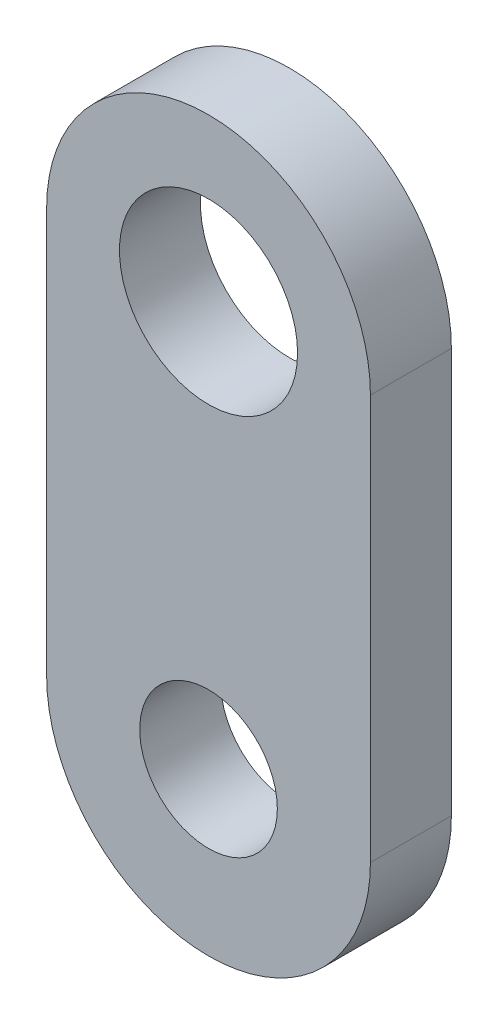
ISO-10303-21;
HEADER;
FILE_DESCRIPTION(('STEP AP214'),'2;1');
FILE_NAME('part.step','',(''),(''),'','','');
FILE_SCHEMA(('AUTOMOTIVE_DESIGN { 1 0 10303 214 1 1 1 1 }'));
ENDSEC;
DATA;
#1=APPLICATION_CONTEXT('core data for automotive mechanical design processes');
#2=APPLICATION_PROTOCOL_DEFINITION('international standard','automotive_design',2000,#1);
#3=PRODUCT_CONTEXT('',#1,'mechanical');
#4=PRODUCT('Part','Part','',(#3));
#5=PRODUCT_RELATED_PRODUCT_CATEGORY('part','',(#4));
#6=PRODUCT_DEFINITION_FORMATION('','',#4);
#7=PRODUCT_DEFINITION_CONTEXT('part definition',#1,'design');
#8=PRODUCT_DEFINITION('design','',#6,#7);
#9=PRODUCT_DEFINITION_SHAPE('','',#8);
#10=(LENGTH_UNIT() NAMED_UNIT(*) SI_UNIT(.MILLI.,.METRE.));
#11=(NAMED_UNIT(*) PLANE_ANGLE_UNIT() SI_UNIT($,.RADIAN.));
#12=(NAMED_UNIT(*) SI_UNIT($,.STERADIAN.) SOLID_ANGLE_UNIT());
#13=UNCERTAINTY_MEASURE_WITH_UNIT(LENGTH_MEASURE(1.E-05),#10,'distance_accuracy_value','');
#14=(GEOMETRIC_REPRESENTATION_CONTEXT(3) GLOBAL_UNCERTAINTY_ASSIGNED_CONTEXT((#13)) GLOBAL_UNIT_ASSIGNED_CONTEXT((#10,
#11,#12)) REPRESENTATION_CONTEXT('',''));
#15=CARTESIAN_POINT('',(0.,0.,0.));
#16=DIRECTION('',(0.,0.,1.));
#17=DIRECTION('',(1.,0.,0.));
#18=AXIS2_PLACEMENT_3D('',#15,#16,#17);
#19=CARTESIAN_POINT('',(0.,-25.,10.));
#20=DIRECTION('',(0.,0.,1.));
#21=DIRECTION('',(1.,0.,0.));
#22=AXIS2_PLACEMENT_3D('',#19,#20,#21);
#23=PLANE('',#22);
#24=CARTESIAN_POINT('',(0.,25.,10.));
#25=DIRECTION('',(0.,0.,1.));
#26=DIRECTION('',(1.,0.,0.));
#27=AXIS2_PLACEMENT_3D('',#24,#25,#26);
#28=CIRCLE('',#27,11.);
#29=CARTESIAN_POINT('',(11.,25.,10.));
#30=VERTEX_POINT('',#29);
#31=EDGE_CURVE('E109',#30,#30,#28,.T.);
#32=ORIENTED_EDGE('',*,*,#31,.F.);
#33=EDGE_LOOP('',(#32));
#34=FACE_BOUND('',#33,.T.);
#35=CARTESIAN_POINT('',(0.,-25.,10.));
#36=DIRECTION('',(0.,0.,1.));
#37=DIRECTION('',(1.,0.,0.));
#38=AXIS2_PLACEMENT_3D('',#35,#36,#37);
#39=CIRCLE('',#38,20.);
#40=CARTESIAN_POINT('',(-20.,-25.,10.));
#41=VERTEX_POINT('',#40);
#42=CARTESIAN_POINT('',(20.,-25.,10.));
#43=VERTEX_POINT('',#42);
#44=EDGE_CURVE('E88',#41,#43,#39,.T.);
#45=ORIENTED_EDGE('',*,*,#44,.T.);
#46=DIRECTION('',(0.,1.,0.));
#47=VECTOR('',#46,1.);
#48=CARTESIAN_POINT('',(20.,25.,10.));
#49=LINE('',#48,#47);
#50=CARTESIAN_POINT('',(20.,25.,10.));
#51=VERTEX_POINT('',#50);
#52=EDGE_CURVE('E83',#43,#51,#49,.T.);
#53=ORIENTED_EDGE('',*,*,#52,.T.);
#54=CARTESIAN_POINT('',(0.,25.,10.));
#55=DIRECTION('',(0.,0.,1.));
#56=DIRECTION('',(-1.,0.,0.));
#57=AXIS2_PLACEMENT_3D('',#54,#55,#56);
#58=CIRCLE('',#57,20.);
#59=CARTESIAN_POINT('',(-20.,25.,10.));
#60=VERTEX_POINT('',#59);
#61=EDGE_CURVE('E86',#51,#60,#58,.T.);
#62=ORIENTED_EDGE('',*,*,#61,.T.);
#63=DIRECTION('',(0.,-1.,0.));
#64=VECTOR('',#63,1.);
#65=CARTESIAN_POINT('',(-20.,25.,10.));
#66=LINE('',#65,#64);
#67=EDGE_CURVE('E53',#60,#41,#66,.T.);
#68=ORIENTED_EDGE('',*,*,#67,.T.);
#69=EDGE_LOOP('',(#45,#53,#62,#68));
#70=FACE_BOUND('',#69,.T.);
#71=CARTESIAN_POINT('',(0.,-25.,10.));
#72=DIRECTION('',(0.,0.,1.));
#73=DIRECTION('',(1.,0.,0.));
#74=AXIS2_PLACEMENT_3D('',#71,#72,#73);
#75=CIRCLE('',#74,8.5);
#76=CARTESIAN_POINT('',(8.50000000000001,-25.,10.));
#77=VERTEX_POINT('',#76);
#78=EDGE_CURVE('E133',#77,#77,#75,.T.);
#79=ORIENTED_EDGE('',*,*,#78,.F.);
#80=EDGE_LOOP('',(#79));
#81=FACE_BOUND('',#80,.T.);
#82=ADVANCED_FACE('F35',(#34,#70,#81),#23,.T.);
#83=CARTESIAN_POINT('',(0.,-25.,0.));
#84=DIRECTION('',(0.,0.,1.));
#85=DIRECTION('',(1.,0.,0.));
#86=AXIS2_PLACEMENT_3D('',#83,#84,#85);
#87=PLANE('',#86);
#88=CARTESIAN_POINT('',(0.,-25.,0.));
#89=DIRECTION('',(0.,0.,1.));
#90=DIRECTION('',(1.,0.,0.));
#91=AXIS2_PLACEMENT_3D('',#88,#89,#90);
#92=CIRCLE('',#91,20.);
#93=CARTESIAN_POINT('',(-20.,-25.,0.));
#94=VERTEX_POINT('',#93);
#95=CARTESIAN_POINT('',(20.,-25.,0.));
#96=VERTEX_POINT('',#95);
#97=EDGE_CURVE('E105',#94,#96,#92,.T.);
#98=ORIENTED_EDGE('',*,*,#97,.F.);
#99=DIRECTION('',(0.,-1.,0.));
#100=VECTOR('',#99,1.);
#101=CARTESIAN_POINT('',(-20.,25.,0.));
#102=LINE('',#101,#100);
#103=CARTESIAN_POINT('',(-20.,25.,0.));
#104=VERTEX_POINT('',#103);
#105=EDGE_CURVE('E76',#104,#94,#102,.T.);
#106=ORIENTED_EDGE('',*,*,#105,.F.);
#107=CARTESIAN_POINT('',(0.,25.,0.));
#108=DIRECTION('',(0.,0.,1.));
#109=DIRECTION('',(-1.,0.,0.));
#110=AXIS2_PLACEMENT_3D('',#107,#108,#109);
#111=CIRCLE('',#110,20.);
#112=CARTESIAN_POINT('',(20.,25.,0.));
#113=VERTEX_POINT('',#112);
#114=EDGE_CURVE('E70',#113,#104,#111,.T.);
#115=ORIENTED_EDGE('',*,*,#114,.F.);
#116=DIRECTION('',(0.,1.,0.));
#117=VECTOR('',#116,1.);
#118=CARTESIAN_POINT('',(20.,25.,0.));
#119=LINE('',#118,#117);
#120=EDGE_CURVE('E93',#96,#113,#119,.T.);
#121=ORIENTED_EDGE('',*,*,#120,.F.);
#122=EDGE_LOOP('',(#98,#106,#115,#121));
#123=FACE_BOUND('',#122,.T.);
#124=CARTESIAN_POINT('',(0.,25.,0.));
#125=DIRECTION('',(0.,0.,1.));
#126=DIRECTION('',(1.,0.,0.));
#127=AXIS2_PLACEMENT_3D('',#124,#125,#126);
#128=CIRCLE('',#127,11.);
#129=CARTESIAN_POINT('',(11.,25.,0.));
#130=VERTEX_POINT('',#129);
#131=EDGE_CURVE('E129',#130,#130,#128,.T.);
#132=ORIENTED_EDGE('',*,*,#131,.T.);
#133=EDGE_LOOP('',(#132));
#134=FACE_BOUND('',#133,.T.);
#135=CARTESIAN_POINT('',(0.,-25.,0.));
#136=DIRECTION('',(0.,0.,1.));
#137=DIRECTION('',(1.,0.,0.));
#138=AXIS2_PLACEMENT_3D('',#135,#136,#137);
#139=CIRCLE('',#138,8.5);
#140=CARTESIAN_POINT('',(8.50000000000001,-25.,0.));
#141=VERTEX_POINT('',#140);
#142=EDGE_CURVE('E137',#141,#141,#139,.T.);
#143=ORIENTED_EDGE('',*,*,#142,.T.);
#144=EDGE_LOOP('',(#143));
#145=FACE_BOUND('',#144,.T.);
#146=ADVANCED_FACE('F123',(#123,#134,#145),#87,.F.);
#147=CARTESIAN_POINT('',(0.,-25.,10.));
#148=DIRECTION('',(0.,0.,-1.));
#149=DIRECTION('',(-1.,0.,0.));
#150=AXIS2_PLACEMENT_3D('',#147,#148,#149);
#151=CYLINDRICAL_SURFACE('',#150,20.);
#152=ORIENTED_EDGE('',*,*,#97,.T.);
#153=DIRECTION('',(0.,0.,-1.));
#154=VECTOR('',#153,1.);
#155=CARTESIAN_POINT('',(20.,-25.,10.));
#156=LINE('',#155,#154);
#157=EDGE_CURVE('E11',#43,#96,#156,.T.);
#158=ORIENTED_EDGE('',*,*,#157,.F.);
#159=ORIENTED_EDGE('',*,*,#44,.F.);
#160=DIRECTION('',(0.,0.,-1.));
#161=VECTOR('',#160,1.);
#162=CARTESIAN_POINT('',(-20.,-25.,10.));
#163=LINE('',#162,#161);
#164=EDGE_CURVE('E101',#41,#94,#163,.T.);
#165=ORIENTED_EDGE('',*,*,#164,.T.);
#166=EDGE_LOOP('',(#152,#158,#159,#165));
#167=FACE_BOUND('',#166,.T.);
#168=ADVANCED_FACE('F37',(#167),#151,.T.);
#169=CARTESIAN_POINT('',(20.,25.,10.));
#170=DIRECTION('',(-1.,0.,0.));
#171=DIRECTION('',(0.,-1.,0.));
#172=AXIS2_PLACEMENT_3D('',#169,#170,#171);
#173=PLANE('',#172);
#174=ORIENTED_EDGE('',*,*,#120,.T.);
#175=DIRECTION('',(0.,0.,-1.));
#176=VECTOR('',#175,1.);
#177=CARTESIAN_POINT('',(20.,25.,10.));
#178=LINE('',#177,#176);
#179=EDGE_CURVE('E45',#51,#113,#178,.T.);
#180=ORIENTED_EDGE('',*,*,#179,.F.);
#181=ORIENTED_EDGE('',*,*,#52,.F.);
#182=ORIENTED_EDGE('',*,*,#157,.T.);
#183=EDGE_LOOP('',(#174,#180,#181,#182));
#184=FACE_BOUND('',#183,.T.);
#185=ADVANCED_FACE('F92',(#184),#173,.F.);
#186=CARTESIAN_POINT('',(0.,25.,10.));
#187=DIRECTION('',(0.,0.,-1.));
#188=DIRECTION('',(-1.,0.,0.));
#189=AXIS2_PLACEMENT_3D('',#186,#187,#188);
#190=CYLINDRICAL_SURFACE('',#189,20.);
#191=ORIENTED_EDGE('',*,*,#114,.T.);
#192=DIRECTION('',(0.,0.,-1.));
#193=VECTOR('',#192,1.);
#194=CARTESIAN_POINT('',(-20.,25.,10.));
#195=LINE('',#194,#193);
#196=EDGE_CURVE('E95',#60,#104,#195,.T.);
#197=ORIENTED_EDGE('',*,*,#196,.F.);
#198=ORIENTED_EDGE('',*,*,#61,.F.);
#199=ORIENTED_EDGE('',*,*,#179,.T.);
#200=EDGE_LOOP('',(#191,#197,#198,#199));
#201=FACE_BOUND('',#200,.T.);
#202=ADVANCED_FACE('F96',(#201),#190,.T.);
#203=CARTESIAN_POINT('',(-20.,25.,10.));
#204=DIRECTION('',(1.,0.,0.));
#205=DIRECTION('',(0.,0.,-1.));
#206=AXIS2_PLACEMENT_3D('',#203,#204,#205);
#207=PLANE('',#206);
#208=ORIENTED_EDGE('',*,*,#105,.T.);
#209=ORIENTED_EDGE('',*,*,#164,.F.);
#210=ORIENTED_EDGE('',*,*,#67,.F.);
#211=ORIENTED_EDGE('',*,*,#196,.T.);
#212=EDGE_LOOP('',(#208,#209,#210,#211));
#213=FACE_BOUND('',#212,.T.);
#214=ADVANCED_FACE('F120',(#213),#207,.F.);
#215=CARTESIAN_POINT('',(0.,25.,10.));
#216=DIRECTION('',(0.,0.,-1.));
#217=DIRECTION('',(-1.,0.,0.));
#218=AXIS2_PLACEMENT_3D('',#215,#216,#217);
#219=CYLINDRICAL_SURFACE('',#218,11.);
#220=ORIENTED_EDGE('',*,*,#31,.T.);
#221=EDGE_LOOP('',(#220));
#222=FACE_BOUND('',#221,.T.);
#223=ORIENTED_EDGE('',*,*,#131,.F.);
#224=EDGE_LOOP('',(#223));
#225=FACE_BOUND('',#224,.T.);
#226=ADVANCED_FACE('F157',(#222,#225),#219,.F.);
#227=CARTESIAN_POINT('',(0.,-25.,10.));
#228=DIRECTION('',(0.,0.,-1.));
#229=DIRECTION('',(-1.,0.,0.));
#230=AXIS2_PLACEMENT_3D('',#227,#228,#229);
#231=CYLINDRICAL_SURFACE('',#230,8.5);
#232=ORIENTED_EDGE('',*,*,#78,.T.);
#233=EDGE_LOOP('',(#232));
#234=FACE_BOUND('',#233,.T.);
#235=ORIENTED_EDGE('',*,*,#142,.F.);
#236=EDGE_LOOP('',(#235));
#237=FACE_BOUND('',#236,.T.);
#238=ADVANCED_FACE('F146',(#234,#237),#231,.F.);
#239=CLOSED_SHELL('',(#82,#146,#168,#185,#202,#214,#226,#238));
#240=MANIFOLD_SOLID_BREP('B2',#239);
#241=ADVANCED_BREP_SHAPE_REPRESENTATION('',(#18,#240),#14);
#242=SHAPE_DEFINITION_REPRESENTATION(#9,#241);
ENDSEC;
END-ISO-10303-21;
